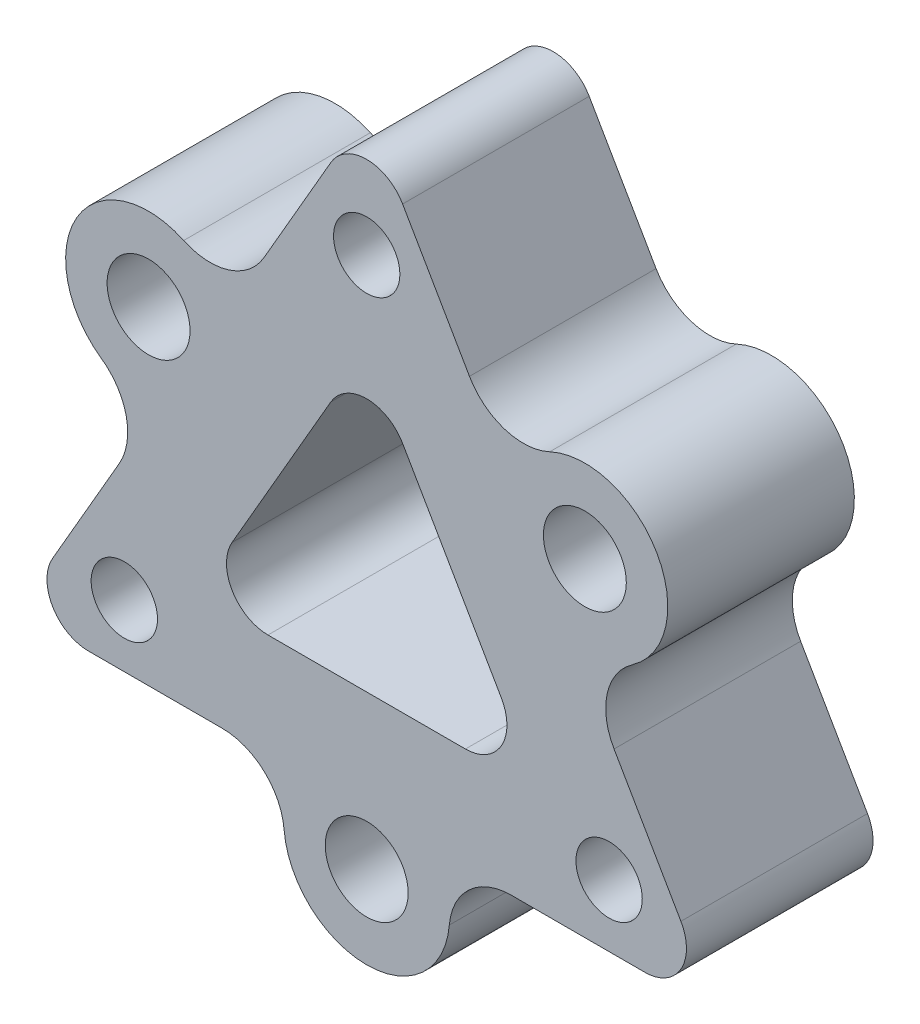
ISO-10303-21;
HEADER;
FILE_DESCRIPTION(('STEP AP214'),'2;1');
FILE_NAME('part.step','',(''),(''),'','','');
FILE_SCHEMA(('AUTOMOTIVE_DESIGN { 1 0 10303 214 1 1 1 1 }'));
ENDSEC;
DATA;
#1=APPLICATION_CONTEXT('core data for automotive mechanical design processes');
#2=APPLICATION_PROTOCOL_DEFINITION('international standard','automotive_design',2000,#1);
#3=PRODUCT_CONTEXT('',#1,'mechanical');
#4=PRODUCT('Part','Part','',(#3));
#5=PRODUCT_RELATED_PRODUCT_CATEGORY('part','',(#4));
#6=PRODUCT_DEFINITION_FORMATION('','',#4);
#7=PRODUCT_DEFINITION_CONTEXT('part definition',#1,'design');
#8=PRODUCT_DEFINITION('design','',#6,#7);
#9=PRODUCT_DEFINITION_SHAPE('','',#8);
#10=(LENGTH_UNIT() NAMED_UNIT(*) SI_UNIT(.MILLI.,.METRE.));
#11=(NAMED_UNIT(*) PLANE_ANGLE_UNIT() SI_UNIT($,.RADIAN.));
#12=(NAMED_UNIT(*) SI_UNIT($,.STERADIAN.) SOLID_ANGLE_UNIT());
#13=UNCERTAINTY_MEASURE_WITH_UNIT(LENGTH_MEASURE(1.E-05),#10,'distance_accuracy_value','');
#14=(GEOMETRIC_REPRESENTATION_CONTEXT(3) GLOBAL_UNCERTAINTY_ASSIGNED_CONTEXT((#13)) GLOBAL_UNIT_ASSIGNED_CONTEXT((#10,
#11,#12)) REPRESENTATION_CONTEXT('',''));
#15=CARTESIAN_POINT('',(0.,0.,0.));
#16=DIRECTION('',(0.,0.,1.));
#17=DIRECTION('',(1.,0.,0.));
#18=AXIS2_PLACEMENT_3D('',#15,#16,#17);
#19=CARTESIAN_POINT('',(-16.8874953737966,-9.75000000000001,9.));
#20=DIRECTION('',(0.,1.,0.));
#21=DIRECTION('',(-1.,0.,0.));
#22=AXIS2_PLACEMENT_3D('',#19,#20,#21);
#23=PLANE('',#22);
#24=DIRECTION('',(1.,0.,0.));
#25=VECTOR('',#24,1.);
#26=CARTESIAN_POINT('',(-16.8874953737966,-9.75000000000001,0.));
#27=LINE('',#26,#25);
#28=CARTESIAN_POINT('',(-13.4233937586588,-9.75000000000001,0.));
#29=VERTEX_POINT('',#28);
#30=CARTESIAN_POINT('',(-6.97423830966508,-9.75000000000001,0.));
#31=VERTEX_POINT('',#30);
#32=EDGE_CURVE('E231',#29,#31,#27,.T.);
#33=ORIENTED_EDGE('',*,*,#32,.T.);
#34=DIRECTION('',(0.,0.,1.));
#35=VECTOR('',#34,1.);
#36=CARTESIAN_POINT('',(-6.97423830966508,-9.75000000000001,9.));
#37=LINE('',#36,#35);
#38=CARTESIAN_POINT('',(-6.97423830966508,-9.75000000000001,9.));
#39=VERTEX_POINT('',#38);
#40=EDGE_CURVE('E300',#31,#39,#37,.T.);
#41=ORIENTED_EDGE('',*,*,#40,.T.);
#42=DIRECTION('',(1.,0.,0.));
#43=VECTOR('',#42,1.);
#44=CARTESIAN_POINT('',(-16.8874953737966,-9.75000000000001,9.));
#45=LINE('',#44,#43);
#46=CARTESIAN_POINT('',(-13.4233937586588,-9.75000000000001,9.));
#47=VERTEX_POINT('',#46);
#48=EDGE_CURVE('E223',#47,#39,#45,.T.);
#49=ORIENTED_EDGE('',*,*,#48,.F.);
#50=DIRECTION('',(0.,0.,-1.));
#51=VECTOR('',#50,1.);
#52=CARTESIAN_POINT('',(-13.4233937586588,-9.75000000000001,9.));
#53=LINE('',#52,#51);
#54=EDGE_CURVE('E257',#47,#29,#53,.T.);
#55=ORIENTED_EDGE('',*,*,#54,.T.);
#56=EDGE_LOOP('',(#33,#41,#49,#55));
#57=FACE_BOUND('',#56,.T.);
#58=ADVANCED_FACE('F35',(#57),#23,.F.);
#59=CARTESIAN_POINT('',(0.,19.5,9.));
#60=DIRECTION('',(0.866025403784438,-0.5,0.));
#61=DIRECTION('',(0.5,0.866025403784439,0.));
#62=AXIS2_PLACEMENT_3D('',#59,#60,#61);
#63=PLANE('',#62);
#64=DIRECTION('',(-0.5,-0.866025403784439,0.));
#65=VECTOR('',#64,1.);
#66=CARTESIAN_POINT('',(0.,19.5,0.));
#67=LINE('',#66,#65);
#68=CARTESIAN_POINT('',(-1.73205080756888,16.5,0.));
#69=VERTEX_POINT('',#68);
#70=CARTESIAN_POINT('',(-4.95662853206574,10.9148675482166,0.));
#71=VERTEX_POINT('',#70);
#72=EDGE_CURVE('E351',#69,#71,#67,.T.);
#73=ORIENTED_EDGE('',*,*,#72,.T.);
#74=DIRECTION('',(0.,0.,1.));
#75=VECTOR('',#74,1.);
#76=CARTESIAN_POINT('',(-4.95662853206574,10.9148675482166,9.));
#77=LINE('',#76,#75);
#78=CARTESIAN_POINT('',(-4.95662853206574,10.9148675482166,9.));
#79=VERTEX_POINT('',#78);
#80=EDGE_CURVE('E310',#71,#79,#77,.T.);
#81=ORIENTED_EDGE('',*,*,#80,.T.);
#82=DIRECTION('',(-0.5,-0.866025403784439,0.));
#83=VECTOR('',#82,1.);
#84=CARTESIAN_POINT('',(0.,19.5,9.));
#85=LINE('',#84,#83);
#86=CARTESIAN_POINT('',(-1.73205080756888,16.5,9.));
#87=VERTEX_POINT('',#86);
#88=EDGE_CURVE('E340',#87,#79,#85,.T.);
#89=ORIENTED_EDGE('',*,*,#88,.F.);
#90=DIRECTION('',(0.,0.,-1.));
#91=VECTOR('',#90,1.);
#92=CARTESIAN_POINT('',(-1.73205080756888,16.5,9.));
#93=LINE('',#92,#91);
#94=EDGE_CURVE('E269',#87,#69,#93,.T.);
#95=ORIENTED_EDGE('',*,*,#94,.T.);
#96=EDGE_LOOP('',(#73,#81,#89,#95));
#97=FACE_BOUND('',#96,.T.);
#98=ADVANCED_FACE('F349',(#97),#63,.F.);
#99=CARTESIAN_POINT('',(16.8874953737966,-9.75,9.));
#100=DIRECTION('',(-0.866025403784439,-0.5,0.));
#101=DIRECTION('',(0.5,-0.866025403784439,0.));
#102=AXIS2_PLACEMENT_3D('',#99,#100,#101);
#103=PLANE('',#102);
#104=DIRECTION('',(-0.5,0.866025403784439,0.));
#105=VECTOR('',#104,1.);
#106=CARTESIAN_POINT('',(16.8874953737966,-9.75,0.));
#107=LINE('',#106,#105);
#108=CARTESIAN_POINT('',(15.1554445662277,-6.75,0.));
#109=VERTEX_POINT('',#108);
#110=CARTESIAN_POINT('',(11.9308668417308,-1.1648675482166,0.));
#111=VERTEX_POINT('',#110);
#112=EDGE_CURVE('E354',#109,#111,#107,.T.);
#113=ORIENTED_EDGE('',*,*,#112,.T.);
#114=DIRECTION('',(0.,0.,1.));
#115=VECTOR('',#114,1.);
#116=CARTESIAN_POINT('',(11.9308668417308,-1.1648675482166,9.));
#117=LINE('',#116,#115);
#118=CARTESIAN_POINT('',(11.9308668417308,-1.1648675482166,9.));
#119=VERTEX_POINT('',#118);
#120=EDGE_CURVE('E283',#111,#119,#117,.T.);
#121=ORIENTED_EDGE('',*,*,#120,.T.);
#122=DIRECTION('',(-0.5,0.866025403784439,0.));
#123=VECTOR('',#122,1.);
#124=CARTESIAN_POINT('',(16.8874953737966,-9.75,9.));
#125=LINE('',#124,#123);
#126=CARTESIAN_POINT('',(15.1554445662277,-6.75,9.));
#127=VERTEX_POINT('',#126);
#128=EDGE_CURVE('E361',#127,#119,#125,.T.);
#129=ORIENTED_EDGE('',*,*,#128,.F.);
#130=DIRECTION('',(0.,0.,-1.));
#131=VECTOR('',#130,1.);
#132=CARTESIAN_POINT('',(15.1554445662277,-6.75,9.));
#133=LINE('',#132,#131);
#134=EDGE_CURVE('E245',#127,#109,#133,.T.);
#135=ORIENTED_EDGE('',*,*,#134,.T.);
#136=EDGE_LOOP('',(#113,#121,#129,#135));
#137=FACE_BOUND('',#136,.T.);
#138=ADVANCED_FACE('F482',(#137),#103,.F.);
#139=CARTESIAN_POINT('',(0.,0.,9.));
#140=DIRECTION('',(0.,0.,1.));
#141=DIRECTION('',(1.,0.,0.));
#142=AXIS2_PLACEMENT_3D('',#139,#140,#141);
#143=PLANE('',#142);
#144=ORIENTED_EDGE('',*,*,#48,.T.);
#145=CARTESIAN_POINT('',(-6.97423830966508,-12.75,9.));
#146=DIRECTION('',(0.,0.,1.));
#147=DIRECTION('',(1.,0.,0.));
#148=AXIS2_PLACEMENT_3D('',#145,#146,#147);
#149=CIRCLE('',#148,3.);
#150=CARTESIAN_POINT('',(-3.98527903409433,-12.4928571428571,9.));
#151=VERTEX_POINT('',#150);
#152=EDGE_CURVE('E324',#39,#151,#149,.F.);
#153=ORIENTED_EDGE('',*,*,#152,.T.);
#154=CARTESIAN_POINT('',(0.,-12.15,9.));
#155=DIRECTION('',(0.,0.,1.));
#156=DIRECTION('',(1.,0.,0.));
#157=AXIS2_PLACEMENT_3D('',#154,#155,#156);
#158=CIRCLE('',#157,4.);
#159=CARTESIAN_POINT('',(3.98527903409433,-12.4928571428571,9.));
#160=VERTEX_POINT('',#159);
#161=EDGE_CURVE('E415',#151,#160,#158,.T.);
#162=ORIENTED_EDGE('',*,*,#161,.T.);
#163=CARTESIAN_POINT('',(6.97423830966508,-12.75,9.));
#164=DIRECTION('',(0.,0.,1.));
#165=DIRECTION('',(1.,0.,0.));
#166=AXIS2_PLACEMENT_3D('',#163,#164,#165);
#167=CIRCLE('',#166,3.);
#168=CARTESIAN_POINT('',(6.97423830966508,-9.75,9.));
#169=VERTEX_POINT('',#168);
#170=EDGE_CURVE('E330',#160,#169,#167,.F.);
#171=ORIENTED_EDGE('',*,*,#170,.T.);
#172=CARTESIAN_POINT('',(13.4233937586588,-9.75,9.));
#173=VERTEX_POINT('',#172);
#174=EDGE_CURVE('E228',#169,#173,#45,.T.);
#175=ORIENTED_EDGE('',*,*,#174,.T.);
#176=CARTESIAN_POINT('',(13.4233937586588,-7.75,9.));
#177=DIRECTION('',(0.,0.,1.));
#178=DIRECTION('',(1.,0.,0.));
#179=AXIS2_PLACEMENT_3D('',#176,#177,#178);
#180=CIRCLE('',#179,2.);
#181=EDGE_CURVE('E267',#173,#127,#180,.T.);
#182=ORIENTED_EDGE('',*,*,#181,.T.);
#183=ORIENTED_EDGE('',*,*,#128,.T.);
#184=CARTESIAN_POINT('',(14.5289430530841,0.335132451783403,9.));
#185=DIRECTION('',(0.,0.,1.));
#186=DIRECTION('',(1.,0.,0.));
#187=AXIS2_PLACEMENT_3D('',#184,#185,#186);
#188=CIRCLE('',#187,3.);
#189=CARTESIAN_POINT('',(12.8117711686113,2.79507568673337,9.));
#190=VERTEX_POINT('',#189);
#191=EDGE_CURVE('E312',#119,#190,#188,.F.);
#192=ORIENTED_EDGE('',*,*,#191,.T.);
#193=CARTESIAN_POINT('',(10.5222086559809,6.07500000000001,9.));
#194=DIRECTION('',(0.,0.,1.));
#195=DIRECTION('',(1.,0.,0.));
#196=AXIS2_PLACEMENT_3D('',#193,#194,#195);
#197=CIRCLE('',#196,4.);
#198=CARTESIAN_POINT('',(8.826492134517,9.69778145612378,9.));
#199=VERTEX_POINT('',#198);
#200=EDGE_CURVE('E397',#190,#199,#197,.T.);
#201=ORIENTED_EDGE('',*,*,#200,.T.);
#202=CARTESIAN_POINT('',(7.55470474341905,12.4148675482166,9.));
#203=DIRECTION('',(0.,0.,1.));
#204=DIRECTION('',(1.,0.,0.));
#205=AXIS2_PLACEMENT_3D('',#202,#203,#204);
#206=CIRCLE('',#205,3.);
#207=CARTESIAN_POINT('',(4.95662853206573,10.9148675482166,9.));
#208=VERTEX_POINT('',#207);
#209=EDGE_CURVE('E318',#199,#208,#206,.F.);
#210=ORIENTED_EDGE('',*,*,#209,.T.);
#211=CARTESIAN_POINT('',(1.73205080756887,16.5,9.));
#212=VERTEX_POINT('',#211);
#213=EDGE_CURVE('E364',#208,#212,#125,.T.);
#214=ORIENTED_EDGE('',*,*,#213,.T.);
#215=CARTESIAN_POINT('',(0.,15.5,9.));
#216=DIRECTION('',(0.,0.,1.));
#217=DIRECTION('',(1.,0.,0.));
#218=AXIS2_PLACEMENT_3D('',#215,#216,#217);
#219=CIRCLE('',#218,2.);
#220=EDGE_CURVE('E263',#212,#87,#219,.T.);
#221=ORIENTED_EDGE('',*,*,#220,.T.);
#222=ORIENTED_EDGE('',*,*,#88,.T.);
#223=CARTESIAN_POINT('',(-7.55470474341906,12.4148675482166,9.));
#224=DIRECTION('',(0.,0.,1.));
#225=DIRECTION('',(1.,0.,0.));
#226=AXIS2_PLACEMENT_3D('',#223,#224,#225);
#227=CIRCLE('',#226,3.);
#228=CARTESIAN_POINT('',(-8.826492134517,9.69778145612377,9.));
#229=VERTEX_POINT('',#228);
#230=EDGE_CURVE('E43',#79,#229,#227,.F.);
#231=ORIENTED_EDGE('',*,*,#230,.T.);
#232=CARTESIAN_POINT('',(-10.5222086559809,6.075,9.));
#233=DIRECTION('',(0.,0.,1.));
#234=DIRECTION('',(1.,0.,0.));
#235=AXIS2_PLACEMENT_3D('',#232,#233,#234);
#236=CIRCLE('',#235,4.);
#237=CARTESIAN_POINT('',(-12.8117711686113,2.79507568673337,9.));
#238=VERTEX_POINT('',#237);
#239=EDGE_CURVE('E337',#229,#238,#236,.T.);
#240=ORIENTED_EDGE('',*,*,#239,.T.);
#241=CARTESIAN_POINT('',(-14.5289430530841,0.3351324517834,9.));
#242=DIRECTION('',(0.,0.,1.));
#243=DIRECTION('',(1.,0.,0.));
#244=AXIS2_PLACEMENT_3D('',#241,#242,#243);
#245=CIRCLE('',#244,3.);
#246=CARTESIAN_POINT('',(-11.9308668417308,-1.1648675482166,9.));
#247=VERTEX_POINT('',#246);
#248=EDGE_CURVE('E322',#238,#247,#245,.F.);
#249=ORIENTED_EDGE('',*,*,#248,.T.);
#250=CARTESIAN_POINT('',(-15.1554445662277,-6.75000000000001,9.));
#251=VERTEX_POINT('',#250);
#252=EDGE_CURVE('E360',#247,#251,#85,.T.);
#253=ORIENTED_EDGE('',*,*,#252,.T.);
#254=CARTESIAN_POINT('',(-13.4233937586588,-7.75000000000001,9.));
#255=DIRECTION('',(0.,0.,1.));
#256=DIRECTION('',(1.,0.,0.));
#257=AXIS2_PLACEMENT_3D('',#254,#255,#256);
#258=CIRCLE('',#257,2.);
#259=EDGE_CURVE('E265',#251,#47,#258,.T.);
#260=ORIENTED_EDGE('',*,*,#259,.T.);
#261=EDGE_LOOP('',(#144,#153,#162,#171,#175,#182,#183,#192,#201,#210,#214,#221,#222,#231,#240,
#249,#253,#260));
#262=FACE_BOUND('',#261,.T.);
#263=CARTESIAN_POINT('',(-11.6913429510899,-6.75000000000001,9.));
#264=DIRECTION('',(0.,0.,1.));
#265=DIRECTION('',(1.,0.,0.));
#266=AXIS2_PLACEMENT_3D('',#263,#264,#265);
#267=CIRCLE('',#266,1.6);
#268=CARTESIAN_POINT('',(-10.0913429510899,-6.75000000000001,9.));
#269=VERTEX_POINT('',#268);
#270=EDGE_CURVE('E369',#269,#269,#267,.T.);
#271=ORIENTED_EDGE('',*,*,#270,.F.);
#272=EDGE_LOOP('',(#271));
#273=FACE_BOUND('',#272,.T.);
#274=CARTESIAN_POINT('',(11.6913429510899,-6.75,9.));
#275=DIRECTION('',(0.,0.,1.));
#276=DIRECTION('',(1.,0.,0.));
#277=AXIS2_PLACEMENT_3D('',#274,#275,#276);
#278=CIRCLE('',#277,1.6);
#279=CARTESIAN_POINT('',(13.2913429510899,-6.75,9.));
#280=VERTEX_POINT('',#279);
#281=EDGE_CURVE('E368',#280,#280,#278,.T.);
#282=ORIENTED_EDGE('',*,*,#281,.F.);
#283=EDGE_LOOP('',(#282));
#284=FACE_BOUND('',#283,.T.);
#285=CARTESIAN_POINT('',(0.,13.5,9.));
#286=DIRECTION('',(0.,0.,1.));
#287=DIRECTION('',(1.,0.,0.));
#288=AXIS2_PLACEMENT_3D('',#285,#286,#287);
#289=CIRCLE('',#288,1.6);
#290=CARTESIAN_POINT('',(1.6,13.5,9.));
#291=VERTEX_POINT('',#290);
#292=EDGE_CURVE('E375',#291,#291,#289,.T.);
#293=ORIENTED_EDGE('',*,*,#292,.F.);
#294=EDGE_LOOP('',(#293));
#295=FACE_BOUND('',#294,.T.);
#296=DIRECTION('',(-0.5,0.866025403784439,0.));
#297=VECTOR('',#296,1.);
#298=CARTESIAN_POINT('',(8.22724133595217,-4.75,9.));
#299=LINE('',#298,#297);
#300=CARTESIAN_POINT('',(6.49519052838329,-1.75,9.));
#301=VERTEX_POINT('',#300);
#302=CARTESIAN_POINT('',(1.73205080756888,6.5,9.));
#303=VERTEX_POINT('',#302);
#304=EDGE_CURVE('E390',#301,#303,#299,.T.);
#305=ORIENTED_EDGE('',*,*,#304,.F.);
#306=CARTESIAN_POINT('',(4.76313972081442,-2.75,9.));
#307=DIRECTION('',(0.,0.,1.));
#308=DIRECTION('',(1.,0.,0.));
#309=AXIS2_PLACEMENT_3D('',#306,#307,#308);
#310=CIRCLE('',#309,2.);
#311=CARTESIAN_POINT('',(4.76313972081442,-4.75,9.));
#312=VERTEX_POINT('',#311);
#313=EDGE_CURVE('E208',#301,#312,#310,.F.);
#314=ORIENTED_EDGE('',*,*,#313,.T.);
#315=DIRECTION('',(1.,0.,0.));
#316=VECTOR('',#315,1.);
#317=CARTESIAN_POINT('',(-8.22724133595218,-4.75000000000001,9.));
#318=LINE('',#317,#316);
#319=CARTESIAN_POINT('',(-4.76313972081442,-4.75000000000001,9.));
#320=VERTEX_POINT('',#319);
#321=EDGE_CURVE('E384',#320,#312,#318,.T.);
#322=ORIENTED_EDGE('',*,*,#321,.F.);
#323=CARTESIAN_POINT('',(-4.76313972081442,-2.75,9.));
#324=DIRECTION('',(0.,0.,1.));
#325=DIRECTION('',(1.,0.,0.));
#326=AXIS2_PLACEMENT_3D('',#323,#324,#325);
#327=CIRCLE('',#326,2.);
#328=CARTESIAN_POINT('',(-6.4951905283833,-1.75,9.));
#329=VERTEX_POINT('',#328);
#330=EDGE_CURVE('E209',#320,#329,#327,.F.);
#331=ORIENTED_EDGE('',*,*,#330,.T.);
#332=DIRECTION('',(-0.5,-0.866025403784439,0.));
#333=VECTOR('',#332,1.);
#334=CARTESIAN_POINT('',(0.,9.5,9.));
#335=LINE('',#334,#333);
#336=CARTESIAN_POINT('',(-1.73205080756888,6.5,9.));
#337=VERTEX_POINT('',#336);
#338=EDGE_CURVE('E381',#337,#329,#335,.T.);
#339=ORIENTED_EDGE('',*,*,#338,.F.);
#340=CARTESIAN_POINT('',(0.,5.5,9.));
#341=DIRECTION('',(0.,0.,1.));
#342=DIRECTION('',(1.,0.,0.));
#343=AXIS2_PLACEMENT_3D('',#340,#341,#342);
#344=CIRCLE('',#343,2.);
#345=EDGE_CURVE('E277',#337,#303,#344,.F.);
#346=ORIENTED_EDGE('',*,*,#345,.T.);
#347=EDGE_LOOP('',(#305,#314,#322,#331,#339,#346));
#348=FACE_BOUND('',#347,.T.);
#349=CARTESIAN_POINT('',(10.5222086559809,6.07500000000001,9.));
#350=DIRECTION('',(0.,0.,1.));
#351=DIRECTION('',(1.,0.,0.));
#352=AXIS2_PLACEMENT_3D('',#349,#350,#351);
#353=CIRCLE('',#352,2.);
#354=CARTESIAN_POINT('',(12.5222086559809,6.07500000000001,9.));
#355=VERTEX_POINT('',#354);
#356=EDGE_CURVE('E400',#355,#355,#353,.T.);
#357=ORIENTED_EDGE('',*,*,#356,.F.);
#358=EDGE_LOOP('',(#357));
#359=FACE_BOUND('',#358,.T.);
#360=CARTESIAN_POINT('',(-10.5222086559809,6.075,9.));
#361=DIRECTION('',(0.,0.,1.));
#362=DIRECTION('',(1.,0.,0.));
#363=AXIS2_PLACEMENT_3D('',#360,#361,#362);
#364=CIRCLE('',#363,2.);
#365=CARTESIAN_POINT('',(-8.52220865598093,6.075,9.));
#366=VERTEX_POINT('',#365);
#367=EDGE_CURVE('E346',#366,#366,#364,.T.);
#368=ORIENTED_EDGE('',*,*,#367,.F.);
#369=EDGE_LOOP('',(#368));
#370=FACE_BOUND('',#369,.T.);
#371=CARTESIAN_POINT('',(0.,-12.15,9.));
#372=DIRECTION('',(0.,0.,1.));
#373=DIRECTION('',(1.,0.,0.));
#374=AXIS2_PLACEMENT_3D('',#371,#372,#373);
#375=CIRCLE('',#374,2.);
#376=CARTESIAN_POINT('',(2.,-12.15,9.));
#377=VERTEX_POINT('',#376);
#378=EDGE_CURVE('E418',#377,#377,#375,.T.);
#379=ORIENTED_EDGE('',*,*,#378,.F.);
#380=EDGE_LOOP('',(#379));
#381=FACE_BOUND('',#380,.T.);
#382=ADVANCED_FACE('F335',(#262,#273,#284,#295,#348,#359,#370,#381),#143,.T.);
#383=CARTESIAN_POINT('',(0.,0.,0.));
#384=DIRECTION('',(0.,0.,1.));
#385=DIRECTION('',(1.,0.,0.));
#386=AXIS2_PLACEMENT_3D('',#383,#384,#385);
#387=PLANE('',#386);
#388=CARTESIAN_POINT('',(0.,13.5,0.));
#389=DIRECTION('',(0.,0.,1.));
#390=DIRECTION('',(1.,0.,0.));
#391=AXIS2_PLACEMENT_3D('',#388,#389,#390);
#392=CIRCLE('',#391,1.6);
#393=CARTESIAN_POINT('',(1.6,13.5,0.));
#394=VERTEX_POINT('',#393);
#395=EDGE_CURVE('E378',#394,#394,#392,.T.);
#396=ORIENTED_EDGE('',*,*,#395,.T.);
#397=EDGE_LOOP('',(#396));
#398=FACE_BOUND('',#397,.T.);
#399=CARTESIAN_POINT('',(-11.6913429510899,-6.75000000000001,0.));
#400=DIRECTION('',(0.,0.,1.));
#401=DIRECTION('',(1.,0.,0.));
#402=AXIS2_PLACEMENT_3D('',#399,#400,#401);
#403=CIRCLE('',#402,1.6);
#404=CARTESIAN_POINT('',(-10.0913429510899,-6.75000000000001,0.));
#405=VERTEX_POINT('',#404);
#406=EDGE_CURVE('E372',#405,#405,#403,.T.);
#407=ORIENTED_EDGE('',*,*,#406,.T.);
#408=EDGE_LOOP('',(#407));
#409=FACE_BOUND('',#408,.T.);
#410=CARTESIAN_POINT('',(11.6913429510899,-6.75,0.));
#411=DIRECTION('',(0.,0.,1.));
#412=DIRECTION('',(1.,0.,0.));
#413=AXIS2_PLACEMENT_3D('',#410,#411,#412);
#414=CIRCLE('',#413,1.6);
#415=CARTESIAN_POINT('',(13.2913429510899,-6.75,0.));
#416=VERTEX_POINT('',#415);
#417=EDGE_CURVE('E365',#416,#416,#414,.T.);
#418=ORIENTED_EDGE('',*,*,#417,.T.);
#419=EDGE_LOOP('',(#418));
#420=FACE_BOUND('',#419,.T.);
#421=CARTESIAN_POINT('',(6.97423830966508,-9.75,0.));
#422=VERTEX_POINT('',#421);
#423=CARTESIAN_POINT('',(13.4233937586588,-9.75,0.));
#424=VERTEX_POINT('',#423);
#425=EDGE_CURVE('E352',#422,#424,#27,.T.);
#426=ORIENTED_EDGE('',*,*,#425,.F.);
#427=CARTESIAN_POINT('',(6.97423830966508,-12.75,0.));
#428=DIRECTION('',(0.,0.,1.));
#429=DIRECTION('',(1.,0.,0.));
#430=AXIS2_PLACEMENT_3D('',#427,#428,#429);
#431=CIRCLE('',#430,3.);
#432=CARTESIAN_POINT('',(3.98527903409433,-12.4928571428571,0.));
#433=VERTEX_POINT('',#432);
#434=EDGE_CURVE('E328',#422,#433,#431,.T.);
#435=ORIENTED_EDGE('',*,*,#434,.T.);
#436=CARTESIAN_POINT('',(0.,-12.15,0.));
#437=DIRECTION('',(0.,0.,1.));
#438=DIRECTION('',(1.,0.,0.));
#439=AXIS2_PLACEMENT_3D('',#436,#437,#438);
#440=CIRCLE('',#439,4.);
#441=CARTESIAN_POINT('',(-3.98527903409433,-12.4928571428571,0.));
#442=VERTEX_POINT('',#441);
#443=EDGE_CURVE('E410',#433,#442,#440,.F.);
#444=ORIENTED_EDGE('',*,*,#443,.T.);
#445=CARTESIAN_POINT('',(-6.97423830966508,-12.75,0.));
#446=DIRECTION('',(0.,0.,1.));
#447=DIRECTION('',(1.,0.,0.));
#448=AXIS2_PLACEMENT_3D('',#445,#446,#447);
#449=CIRCLE('',#448,3.);
#450=EDGE_CURVE('E326',#442,#31,#449,.T.);
#451=ORIENTED_EDGE('',*,*,#450,.T.);
#452=ORIENTED_EDGE('',*,*,#32,.F.);
#453=CARTESIAN_POINT('',(-13.4233937586588,-7.75000000000001,0.));
#454=DIRECTION('',(0.,0.,1.));
#455=DIRECTION('',(1.,0.,0.));
#456=AXIS2_PLACEMENT_3D('',#453,#454,#455);
#457=CIRCLE('',#456,2.);
#458=CARTESIAN_POINT('',(-15.1554445662277,-6.75000000000001,0.));
#459=VERTEX_POINT('',#458);
#460=EDGE_CURVE('E251',#29,#459,#457,.F.);
#461=ORIENTED_EDGE('',*,*,#460,.T.);
#462=CARTESIAN_POINT('',(-11.9308668417308,-1.1648675482166,0.));
#463=VERTEX_POINT('',#462);
#464=EDGE_CURVE('E353',#463,#459,#67,.T.);
#465=ORIENTED_EDGE('',*,*,#464,.F.);
#466=CARTESIAN_POINT('',(-14.5289430530841,0.3351324517834,0.));
#467=DIRECTION('',(0.,0.,1.));
#468=DIRECTION('',(1.,0.,0.));
#469=AXIS2_PLACEMENT_3D('',#466,#467,#468);
#470=CIRCLE('',#469,3.);
#471=CARTESIAN_POINT('',(-12.8117711686113,2.79507568673337,0.));
#472=VERTEX_POINT('',#471);
#473=EDGE_CURVE('E320',#463,#472,#470,.T.);
#474=ORIENTED_EDGE('',*,*,#473,.T.);
#475=CARTESIAN_POINT('',(-10.5222086559809,6.075,0.));
#476=DIRECTION('',(0.,0.,1.));
#477=DIRECTION('',(1.,0.,0.));
#478=AXIS2_PLACEMENT_3D('',#475,#476,#477);
#479=CIRCLE('',#478,4.);
#480=CARTESIAN_POINT('',(-8.826492134517,9.69778145612377,0.));
#481=VERTEX_POINT('',#480);
#482=EDGE_CURVE('E403',#472,#481,#479,.F.);
#483=ORIENTED_EDGE('',*,*,#482,.T.);
#484=CARTESIAN_POINT('',(-7.55470474341906,12.4148675482166,0.));
#485=DIRECTION('',(0.,0.,1.));
#486=DIRECTION('',(1.,0.,0.));
#487=AXIS2_PLACEMENT_3D('',#484,#485,#486);
#488=CIRCLE('',#487,3.);
#489=EDGE_CURVE('E11',#481,#71,#488,.T.);
#490=ORIENTED_EDGE('',*,*,#489,.T.);
#491=ORIENTED_EDGE('',*,*,#72,.F.);
#492=CARTESIAN_POINT('',(0.,15.5,0.));
#493=DIRECTION('',(0.,0.,1.));
#494=DIRECTION('',(1.,0.,0.));
#495=AXIS2_PLACEMENT_3D('',#492,#493,#494);
#496=CIRCLE('',#495,2.);
#497=CARTESIAN_POINT('',(1.73205080756887,16.5,0.));
#498=VERTEX_POINT('',#497);
#499=EDGE_CURVE('E248',#69,#498,#496,.F.);
#500=ORIENTED_EDGE('',*,*,#499,.T.);
#501=CARTESIAN_POINT('',(4.95662853206573,10.9148675482166,0.));
#502=VERTEX_POINT('',#501);
#503=EDGE_CURVE('E357',#502,#498,#107,.T.);
#504=ORIENTED_EDGE('',*,*,#503,.F.);
#505=CARTESIAN_POINT('',(7.55470474341905,12.4148675482166,0.));
#506=DIRECTION('',(0.,0.,1.));
#507=DIRECTION('',(1.,0.,0.));
#508=AXIS2_PLACEMENT_3D('',#505,#506,#507);
#509=CIRCLE('',#508,3.);
#510=CARTESIAN_POINT('',(8.826492134517,9.69778145612378,0.));
#511=VERTEX_POINT('',#510);
#512=EDGE_CURVE('E316',#502,#511,#509,.T.);
#513=ORIENTED_EDGE('',*,*,#512,.T.);
#514=CARTESIAN_POINT('',(10.5222086559809,6.07500000000001,0.));
#515=DIRECTION('',(0.,0.,1.));
#516=DIRECTION('',(1.,0.,0.));
#517=AXIS2_PLACEMENT_3D('',#514,#515,#516);
#518=CIRCLE('',#517,4.);
#519=CARTESIAN_POINT('',(12.8117711686113,2.79507568673337,0.));
#520=VERTEX_POINT('',#519);
#521=EDGE_CURVE('E387',#511,#520,#518,.F.);
#522=ORIENTED_EDGE('',*,*,#521,.T.);
#523=CARTESIAN_POINT('',(14.5289430530841,0.335132451783403,0.));
#524=DIRECTION('',(0.,0.,1.));
#525=DIRECTION('',(1.,0.,0.));
#526=AXIS2_PLACEMENT_3D('',#523,#524,#525);
#527=CIRCLE('',#526,3.);
#528=EDGE_CURVE('E314',#520,#111,#527,.T.);
#529=ORIENTED_EDGE('',*,*,#528,.T.);
#530=ORIENTED_EDGE('',*,*,#112,.F.);
#531=CARTESIAN_POINT('',(13.4233937586588,-7.75,0.));
#532=DIRECTION('',(0.,0.,1.));
#533=DIRECTION('',(1.,0.,0.));
#534=AXIS2_PLACEMENT_3D('',#531,#532,#533);
#535=CIRCLE('',#534,2.);
#536=EDGE_CURVE('E254',#109,#424,#535,.F.);
#537=ORIENTED_EDGE('',*,*,#536,.T.);
#538=EDGE_LOOP('',(#426,#435,#444,#451,#452,#461,#465,#474,#483,#490,#491,#500,#504,#513,#522,
#529,#530,#537));
#539=FACE_BOUND('',#538,.T.);
#540=DIRECTION('',(-0.5,-0.866025403784439,0.));
#541=VECTOR('',#540,1.);
#542=CARTESIAN_POINT('',(0.,9.5,0.));
#543=LINE('',#542,#541);
#544=CARTESIAN_POINT('',(-1.73205080756888,6.5,0.));
#545=VERTEX_POINT('',#544);
#546=CARTESIAN_POINT('',(-6.4951905283833,-1.75,0.));
#547=VERTEX_POINT('',#546);
#548=EDGE_CURVE('E219',#545,#547,#543,.T.);
#549=ORIENTED_EDGE('',*,*,#548,.T.);
#550=CARTESIAN_POINT('',(-4.76313972081442,-2.75,0.));
#551=DIRECTION('',(0.,0.,1.));
#552=DIRECTION('',(1.,0.,0.));
#553=AXIS2_PLACEMENT_3D('',#550,#551,#552);
#554=CIRCLE('',#553,2.);
#555=CARTESIAN_POINT('',(-4.76313972081442,-4.75000000000001,0.));
#556=VERTEX_POINT('',#555);
#557=EDGE_CURVE('E279',#547,#556,#554,.T.);
#558=ORIENTED_EDGE('',*,*,#557,.T.);
#559=DIRECTION('',(1.,0.,0.));
#560=VECTOR('',#559,1.);
#561=CARTESIAN_POINT('',(-8.22724133595218,-4.75000000000001,0.));
#562=LINE('',#561,#560);
#563=CARTESIAN_POINT('',(4.76313972081442,-4.75,0.));
#564=VERTEX_POINT('',#563);
#565=EDGE_CURVE('E203',#556,#564,#562,.T.);
#566=ORIENTED_EDGE('',*,*,#565,.T.);
#567=CARTESIAN_POINT('',(4.76313972081442,-2.75,0.));
#568=DIRECTION('',(0.,0.,1.));
#569=DIRECTION('',(1.,0.,0.));
#570=AXIS2_PLACEMENT_3D('',#567,#568,#569);
#571=CIRCLE('',#570,2.);
#572=CARTESIAN_POINT('',(6.49519052838329,-1.75,0.));
#573=VERTEX_POINT('',#572);
#574=EDGE_CURVE('E196',#564,#573,#571,.T.);
#575=ORIENTED_EDGE('',*,*,#574,.T.);
#576=DIRECTION('',(-0.5,0.866025403784439,0.));
#577=VECTOR('',#576,1.);
#578=CARTESIAN_POINT('',(8.22724133595217,-4.75,0.));
#579=LINE('',#578,#577);
#580=CARTESIAN_POINT('',(1.73205080756888,6.5,0.));
#581=VERTEX_POINT('',#580);
#582=EDGE_CURVE('E201',#573,#581,#579,.T.);
#583=ORIENTED_EDGE('',*,*,#582,.T.);
#584=CARTESIAN_POINT('',(0.,5.5,0.));
#585=DIRECTION('',(0.,0.,1.));
#586=DIRECTION('',(1.,0.,0.));
#587=AXIS2_PLACEMENT_3D('',#584,#585,#586);
#588=CIRCLE('',#587,2.);
#589=EDGE_CURVE('E275',#581,#545,#588,.T.);
#590=ORIENTED_EDGE('',*,*,#589,.T.);
#591=EDGE_LOOP('',(#549,#558,#566,#575,#583,#590));
#592=FACE_BOUND('',#591,.T.);
#593=CARTESIAN_POINT('',(10.5222086559809,6.07500000000001,0.));
#594=DIRECTION('',(0.,0.,1.));
#595=DIRECTION('',(1.,0.,0.));
#596=AXIS2_PLACEMENT_3D('',#593,#594,#595);
#597=CIRCLE('',#596,2.);
#598=CARTESIAN_POINT('',(12.5222086559809,6.07500000000001,0.));
#599=VERTEX_POINT('',#598);
#600=EDGE_CURVE('E394',#599,#599,#597,.F.);
#601=ORIENTED_EDGE('',*,*,#600,.F.);
#602=EDGE_LOOP('',(#601));
#603=FACE_BOUND('',#602,.T.);
#604=CARTESIAN_POINT('',(-10.5222086559809,6.075,0.));
#605=DIRECTION('',(0.,0.,1.));
#606=DIRECTION('',(1.,0.,0.));
#607=AXIS2_PLACEMENT_3D('',#604,#605,#606);
#608=CIRCLE('',#607,2.);
#609=CARTESIAN_POINT('',(-8.52220865598093,6.075,0.));
#610=VERTEX_POINT('',#609);
#611=EDGE_CURVE('E345',#610,#610,#608,.F.);
#612=ORIENTED_EDGE('',*,*,#611,.F.);
#613=EDGE_LOOP('',(#612));
#614=FACE_BOUND('',#613,.T.);
#615=CARTESIAN_POINT('',(0.,-12.15,0.));
#616=DIRECTION('',(0.,0.,1.));
#617=DIRECTION('',(1.,0.,0.));
#618=AXIS2_PLACEMENT_3D('',#615,#616,#617);
#619=CIRCLE('',#618,2.);
#620=CARTESIAN_POINT('',(2.,-12.15,0.));
#621=VERTEX_POINT('',#620);
#622=EDGE_CURVE('E412',#621,#621,#619,.F.);
#623=ORIENTED_EDGE('',*,*,#622,.F.);
#624=EDGE_LOOP('',(#623));
#625=FACE_BOUND('',#624,.T.);
#626=ADVANCED_FACE('F199',(#398,#409,#420,#539,#592,#603,#614,#625),#387,.F.);
#627=ORIENTED_EDGE('',*,*,#213,.F.);
#628=DIRECTION('',(0.,0.,1.));
#629=VECTOR('',#628,1.);
#630=CARTESIAN_POINT('',(4.95662853206574,10.9148675482166,9.));
#631=LINE('',#630,#629);
#632=EDGE_CURVE('E290',#208,#502,#631,.F.);
#633=ORIENTED_EDGE('',*,*,#632,.T.);
#634=ORIENTED_EDGE('',*,*,#503,.T.);
#635=DIRECTION('',(0.,0.,-1.));
#636=VECTOR('',#635,1.);
#637=CARTESIAN_POINT('',(1.73205080756888,16.5,9.));
#638=LINE('',#637,#636);
#639=EDGE_CURVE('E242',#498,#212,#638,.F.);
#640=ORIENTED_EDGE('',*,*,#639,.T.);
#641=EDGE_LOOP('',(#627,#633,#634,#640));
#642=FACE_BOUND('',#641,.T.);
#643=ADVANCED_FACE('F449',(#642),#103,.F.);
#644=ORIENTED_EDGE('',*,*,#252,.F.);
#645=DIRECTION('',(0.,0.,1.));
#646=VECTOR('',#645,1.);
#647=CARTESIAN_POINT('',(-11.9308668417308,-1.1648675482166,9.));
#648=LINE('',#647,#646);
#649=EDGE_CURVE('E293',#247,#463,#648,.F.);
#650=ORIENTED_EDGE('',*,*,#649,.T.);
#651=ORIENTED_EDGE('',*,*,#464,.T.);
#652=DIRECTION('',(0.,0.,-1.));
#653=VECTOR('',#652,1.);
#654=CARTESIAN_POINT('',(-15.1554445662277,-6.75000000000001,9.));
#655=LINE('',#654,#653);
#656=EDGE_CURVE('E272',#459,#251,#655,.F.);
#657=ORIENTED_EDGE('',*,*,#656,.T.);
#658=EDGE_LOOP('',(#644,#650,#651,#657));
#659=FACE_BOUND('',#658,.T.);
#660=ADVANCED_FACE('F484',(#659),#63,.F.);
#661=ORIENTED_EDGE('',*,*,#174,.F.);
#662=DIRECTION('',(0.,0.,1.));
#663=VECTOR('',#662,1.);
#664=CARTESIAN_POINT('',(6.97423830966508,-9.75,9.));
#665=LINE('',#664,#663);
#666=EDGE_CURVE('E307',#169,#422,#665,.F.);
#667=ORIENTED_EDGE('',*,*,#666,.T.);
#668=ORIENTED_EDGE('',*,*,#425,.T.);
#669=DIRECTION('',(0.,0.,-1.));
#670=VECTOR('',#669,1.);
#671=CARTESIAN_POINT('',(13.4233937586588,-9.75,9.));
#672=LINE('',#671,#670);
#673=EDGE_CURVE('E260',#424,#173,#672,.F.);
#674=ORIENTED_EDGE('',*,*,#673,.T.);
#675=EDGE_LOOP('',(#661,#667,#668,#674));
#676=FACE_BOUND('',#675,.T.);
#677=ADVANCED_FACE('F477',(#676),#23,.F.);
#678=CARTESIAN_POINT('',(11.6913429510899,-6.75,9.));
#679=DIRECTION('',(0.,0.,-1.));
#680=DIRECTION('',(-1.,0.,0.));
#681=AXIS2_PLACEMENT_3D('',#678,#679,#680);
#682=CYLINDRICAL_SURFACE('',#681,1.6);
#683=ORIENTED_EDGE('',*,*,#281,.T.);
#684=EDGE_LOOP('',(#683));
#685=FACE_BOUND('',#684,.T.);
#686=ORIENTED_EDGE('',*,*,#417,.F.);
#687=EDGE_LOOP('',(#686));
#688=FACE_BOUND('',#687,.T.);
#689=ADVANCED_FACE('F487',(#685,#688),#682,.F.);
#690=CARTESIAN_POINT('',(-11.6913429510899,-6.75000000000001,9.));
#691=DIRECTION('',(0.,0.,-1.));
#692=DIRECTION('',(-1.,0.,0.));
#693=AXIS2_PLACEMENT_3D('',#690,#691,#692);
#694=CYLINDRICAL_SURFACE('',#693,1.6);
#695=ORIENTED_EDGE('',*,*,#270,.T.);
#696=EDGE_LOOP('',(#695));
#697=FACE_BOUND('',#696,.T.);
#698=ORIENTED_EDGE('',*,*,#406,.F.);
#699=EDGE_LOOP('',(#698));
#700=FACE_BOUND('',#699,.T.);
#701=ADVANCED_FACE('F494',(#697,#700),#694,.F.);
#702=CARTESIAN_POINT('',(0.,13.5,9.));
#703=DIRECTION('',(0.,0.,-1.));
#704=DIRECTION('',(-1.,0.,0.));
#705=AXIS2_PLACEMENT_3D('',#702,#703,#704);
#706=CYLINDRICAL_SURFACE('',#705,1.6);
#707=ORIENTED_EDGE('',*,*,#292,.T.);
#708=EDGE_LOOP('',(#707));
#709=FACE_BOUND('',#708,.T.);
#710=ORIENTED_EDGE('',*,*,#395,.F.);
#711=EDGE_LOOP('',(#710));
#712=FACE_BOUND('',#711,.T.);
#713=ADVANCED_FACE('F536',(#709,#712),#706,.F.);
#714=CARTESIAN_POINT('',(-8.22724133595218,-4.75000000000001,9.));
#715=DIRECTION('',(0.,1.,0.));
#716=DIRECTION('',(-1.,0.,0.));
#717=AXIS2_PLACEMENT_3D('',#714,#715,#716);
#718=PLANE('',#717);
#719=ORIENTED_EDGE('',*,*,#565,.F.);
#720=DIRECTION('',(0.,0.,-1.));
#721=VECTOR('',#720,1.);
#722=CARTESIAN_POINT('',(-4.76313972081442,-4.75000000000001,9.));
#723=LINE('',#722,#721);
#724=EDGE_CURVE('E240',#556,#320,#723,.F.);
#725=ORIENTED_EDGE('',*,*,#724,.T.);
#726=ORIENTED_EDGE('',*,*,#321,.T.);
#727=DIRECTION('',(0.,0.,-1.));
#728=VECTOR('',#727,1.);
#729=CARTESIAN_POINT('',(4.76313972081442,-4.75,0.));
#730=LINE('',#729,#728);
#731=EDGE_CURVE('E238',#312,#564,#730,.T.);
#732=ORIENTED_EDGE('',*,*,#731,.T.);
#733=EDGE_LOOP('',(#719,#725,#726,#732));
#734=FACE_BOUND('',#733,.T.);
#735=ADVANCED_FACE('F533',(#734),#718,.T.);
#736=CARTESIAN_POINT('',(8.22724133595217,-4.75,9.));
#737=DIRECTION('',(-0.866025403784439,-0.5,0.));
#738=DIRECTION('',(0.5,-0.866025403784439,0.));
#739=AXIS2_PLACEMENT_3D('',#736,#737,#738);
#740=PLANE('',#739);
#741=ORIENTED_EDGE('',*,*,#304,.T.);
#742=DIRECTION('',(0.,0.,-1.));
#743=VECTOR('',#742,1.);
#744=CARTESIAN_POINT('',(1.73205080756888,6.5,0.));
#745=LINE('',#744,#743);
#746=EDGE_CURVE('E218',#303,#581,#745,.T.);
#747=ORIENTED_EDGE('',*,*,#746,.T.);
#748=ORIENTED_EDGE('',*,*,#582,.F.);
#749=DIRECTION('',(0.,0.,-1.));
#750=VECTOR('',#749,1.);
#751=CARTESIAN_POINT('',(6.49519052838329,-1.75,9.));
#752=LINE('',#751,#750);
#753=EDGE_CURVE('E215',#573,#301,#752,.F.);
#754=ORIENTED_EDGE('',*,*,#753,.T.);
#755=EDGE_LOOP('',(#741,#747,#748,#754));
#756=FACE_BOUND('',#755,.T.);
#757=ADVANCED_FACE('F214',(#756),#740,.T.);
#758=CARTESIAN_POINT('',(0.,9.5,9.));
#759=DIRECTION('',(0.866025403784438,-0.5,0.));
#760=DIRECTION('',(0.5,0.866025403784439,0.));
#761=AXIS2_PLACEMENT_3D('',#758,#759,#760);
#762=PLANE('',#761);
#763=ORIENTED_EDGE('',*,*,#548,.F.);
#764=DIRECTION('',(0.,0.,-1.));
#765=VECTOR('',#764,1.);
#766=CARTESIAN_POINT('',(-1.73205080756888,6.5,9.));
#767=LINE('',#766,#765);
#768=EDGE_CURVE('E236',#545,#337,#767,.F.);
#769=ORIENTED_EDGE('',*,*,#768,.T.);
#770=ORIENTED_EDGE('',*,*,#338,.T.);
#771=DIRECTION('',(0.,0.,-1.));
#772=VECTOR('',#771,1.);
#773=CARTESIAN_POINT('',(-6.4951905283833,-1.75,0.));
#774=LINE('',#773,#772);
#775=EDGE_CURVE('E225',#329,#547,#774,.T.);
#776=ORIENTED_EDGE('',*,*,#775,.T.);
#777=EDGE_LOOP('',(#763,#769,#770,#776));
#778=FACE_BOUND('',#777,.T.);
#779=ADVANCED_FACE('F526',(#778),#762,.T.);
#780=CARTESIAN_POINT('',(0.,5.5,9.));
#781=DIRECTION('',(0.,0.,1.));
#782=DIRECTION('',(1.,0.,0.));
#783=AXIS2_PLACEMENT_3D('',#780,#781,#782);
#784=CYLINDRICAL_SURFACE('',#783,2.);
#785=ORIENTED_EDGE('',*,*,#345,.F.);
#786=ORIENTED_EDGE('',*,*,#768,.F.);
#787=ORIENTED_EDGE('',*,*,#589,.F.);
#788=ORIENTED_EDGE('',*,*,#746,.F.);
#789=EDGE_LOOP('',(#785,#786,#787,#788));
#790=FACE_BOUND('',#789,.T.);
#791=ADVANCED_FACE('F529',(#790),#784,.F.);
#792=CARTESIAN_POINT('',(-4.76313972081442,-2.75,9.));
#793=DIRECTION('',(0.,0.,1.));
#794=DIRECTION('',(1.,0.,0.));
#795=AXIS2_PLACEMENT_3D('',#792,#793,#794);
#796=CYLINDRICAL_SURFACE('',#795,2.);
#797=ORIENTED_EDGE('',*,*,#330,.F.);
#798=ORIENTED_EDGE('',*,*,#724,.F.);
#799=ORIENTED_EDGE('',*,*,#557,.F.);
#800=ORIENTED_EDGE('',*,*,#775,.F.);
#801=EDGE_LOOP('',(#797,#798,#799,#800));
#802=FACE_BOUND('',#801,.T.);
#803=ADVANCED_FACE('F580',(#802),#796,.F.);
#804=CARTESIAN_POINT('',(4.76313972081442,-2.75,9.));
#805=DIRECTION('',(0.,0.,1.));
#806=DIRECTION('',(1.,0.,0.));
#807=AXIS2_PLACEMENT_3D('',#804,#805,#806);
#808=CYLINDRICAL_SURFACE('',#807,2.);
#809=ORIENTED_EDGE('',*,*,#313,.F.);
#810=ORIENTED_EDGE('',*,*,#753,.F.);
#811=ORIENTED_EDGE('',*,*,#574,.F.);
#812=ORIENTED_EDGE('',*,*,#731,.F.);
#813=EDGE_LOOP('',(#809,#810,#811,#812));
#814=FACE_BOUND('',#813,.T.);
#815=ADVANCED_FACE('F222',(#814),#808,.F.);
#816=CARTESIAN_POINT('',(13.4233937586588,-7.75,9.));
#817=DIRECTION('',(0.,0.,-1.));
#818=DIRECTION('',(-1.,0.,0.));
#819=AXIS2_PLACEMENT_3D('',#816,#817,#818);
#820=CYLINDRICAL_SURFACE('',#819,2.);
#821=ORIENTED_EDGE('',*,*,#181,.F.);
#822=ORIENTED_EDGE('',*,*,#673,.F.);
#823=ORIENTED_EDGE('',*,*,#536,.F.);
#824=ORIENTED_EDGE('',*,*,#134,.F.);
#825=EDGE_LOOP('',(#821,#822,#823,#824));
#826=FACE_BOUND('',#825,.T.);
#827=ADVANCED_FACE('F572',(#826),#820,.T.);
#828=CARTESIAN_POINT('',(-13.4233937586588,-7.75000000000001,9.));
#829=DIRECTION('',(0.,0.,-1.));
#830=DIRECTION('',(-1.,0.,0.));
#831=AXIS2_PLACEMENT_3D('',#828,#829,#830);
#832=CYLINDRICAL_SURFACE('',#831,2.);
#833=ORIENTED_EDGE('',*,*,#259,.F.);
#834=ORIENTED_EDGE('',*,*,#656,.F.);
#835=ORIENTED_EDGE('',*,*,#460,.F.);
#836=ORIENTED_EDGE('',*,*,#54,.F.);
#837=EDGE_LOOP('',(#833,#834,#835,#836));
#838=FACE_BOUND('',#837,.T.);
#839=ADVANCED_FACE('F441',(#838),#832,.T.);
#840=CARTESIAN_POINT('',(0.,15.5,9.));
#841=DIRECTION('',(0.,0.,-1.));
#842=DIRECTION('',(-1.,0.,0.));
#843=AXIS2_PLACEMENT_3D('',#840,#841,#842);
#844=CYLINDRICAL_SURFACE('',#843,2.);
#845=ORIENTED_EDGE('',*,*,#220,.F.);
#846=ORIENTED_EDGE('',*,*,#639,.F.);
#847=ORIENTED_EDGE('',*,*,#499,.F.);
#848=ORIENTED_EDGE('',*,*,#94,.F.);
#849=EDGE_LOOP('',(#845,#846,#847,#848));
#850=FACE_BOUND('',#849,.T.);
#851=ADVANCED_FACE('F452',(#850),#844,.T.);
#852=CARTESIAN_POINT('',(10.5222086559809,6.07500000000001,-11.3137084989848));
#853=DIRECTION('',(0.,0.,1.));
#854=DIRECTION('',(1.,0.,0.));
#855=AXIS2_PLACEMENT_3D('',#852,#853,#854);
#856=CYLINDRICAL_SURFACE('',#855,4.);
#857=ORIENTED_EDGE('',*,*,#200,.F.);
#858=DIRECTION('',(0.,0.,1.));
#859=VECTOR('',#858,1.);
#860=CARTESIAN_POINT('',(12.8117711686113,2.79507568673337,-11.3137084989848));
#861=LINE('',#860,#859);
#862=EDGE_CURVE('E288',#190,#520,#861,.F.);
#863=ORIENTED_EDGE('',*,*,#862,.T.);
#864=ORIENTED_EDGE('',*,*,#521,.F.);
#865=DIRECTION('',(0.,0.,1.));
#866=VECTOR('',#865,1.);
#867=CARTESIAN_POINT('',(8.826492134517,9.69778145612378,-11.3137084989848));
#868=LINE('',#867,#866);
#869=EDGE_CURVE('E286',#511,#199,#868,.T.);
#870=ORIENTED_EDGE('',*,*,#869,.T.);
#871=EDGE_LOOP('',(#857,#863,#864,#870));
#872=FACE_BOUND('',#871,.T.);
#873=ADVANCED_FACE('F459',(#872),#856,.T.);
#874=CARTESIAN_POINT('',(10.5222086559809,6.07500000000001,-11.3137084989848));
#875=DIRECTION('',(0.,0.,1.));
#876=DIRECTION('',(1.,0.,0.));
#877=AXIS2_PLACEMENT_3D('',#874,#875,#876);
#878=CYLINDRICAL_SURFACE('',#877,2.);
#879=ORIENTED_EDGE('',*,*,#600,.T.);
#880=EDGE_LOOP('',(#879));
#881=FACE_BOUND('',#880,.T.);
#882=ORIENTED_EDGE('',*,*,#356,.T.);
#883=EDGE_LOOP('',(#882));
#884=FACE_BOUND('',#883,.T.);
#885=ADVANCED_FACE('F520',(#881,#884),#878,.F.);
#886=CARTESIAN_POINT('',(-10.5222086559809,6.075,-11.3137084989848));
#887=DIRECTION('',(0.,0.,1.));
#888=DIRECTION('',(1.,0.,0.));
#889=AXIS2_PLACEMENT_3D('',#886,#887,#888);
#890=CYLINDRICAL_SURFACE('',#889,4.);
#891=ORIENTED_EDGE('',*,*,#482,.F.);
#892=DIRECTION('',(0.,0.,1.));
#893=VECTOR('',#892,1.);
#894=CARTESIAN_POINT('',(-12.8117711686113,2.79507568673337,-11.3137084989848));
#895=LINE('',#894,#893);
#896=EDGE_CURVE('E298',#472,#238,#895,.T.);
#897=ORIENTED_EDGE('',*,*,#896,.T.);
#898=ORIENTED_EDGE('',*,*,#239,.F.);
#899=DIRECTION('',(0.,0.,1.));
#900=VECTOR('',#899,1.);
#901=CARTESIAN_POINT('',(-8.826492134517,9.69778145612377,-11.3137084989848));
#902=LINE('',#901,#900);
#903=EDGE_CURVE('E296',#229,#481,#902,.F.);
#904=ORIENTED_EDGE('',*,*,#903,.T.);
#905=EDGE_LOOP('',(#891,#897,#898,#904));
#906=FACE_BOUND('',#905,.T.);
#907=ADVANCED_FACE('F343',(#906),#890,.T.);
#908=CARTESIAN_POINT('',(-10.5222086559809,6.075,-11.3137084989848));
#909=DIRECTION('',(0.,0.,1.));
#910=DIRECTION('',(1.,0.,0.));
#911=AXIS2_PLACEMENT_3D('',#908,#909,#910);
#912=CYLINDRICAL_SURFACE('',#911,2.);
#913=ORIENTED_EDGE('',*,*,#611,.T.);
#914=EDGE_LOOP('',(#913));
#915=FACE_BOUND('',#914,.T.);
#916=ORIENTED_EDGE('',*,*,#367,.T.);
#917=EDGE_LOOP('',(#916));
#918=FACE_BOUND('',#917,.T.);
#919=ADVANCED_FACE('F507',(#915,#918),#912,.F.);
#920=CARTESIAN_POINT('',(0.,-12.15,-11.3137084989848));
#921=DIRECTION('',(0.,0.,1.));
#922=DIRECTION('',(1.,0.,0.));
#923=AXIS2_PLACEMENT_3D('',#920,#921,#922);
#924=CYLINDRICAL_SURFACE('',#923,4.);
#925=ORIENTED_EDGE('',*,*,#161,.F.);
#926=DIRECTION('',(0.,0.,1.));
#927=VECTOR('',#926,1.);
#928=CARTESIAN_POINT('',(-3.98527903409433,-12.4928571428571,-11.3137084989848));
#929=LINE('',#928,#927);
#930=EDGE_CURVE('E305',#151,#442,#929,.F.);
#931=ORIENTED_EDGE('',*,*,#930,.T.);
#932=ORIENTED_EDGE('',*,*,#443,.F.);
#933=DIRECTION('',(0.,0.,1.));
#934=VECTOR('',#933,1.);
#935=CARTESIAN_POINT('',(3.98527903409433,-12.4928571428571,-11.3137084989848));
#936=LINE('',#935,#934);
#937=EDGE_CURVE('E303',#433,#160,#936,.T.);
#938=ORIENTED_EDGE('',*,*,#937,.T.);
#939=EDGE_LOOP('',(#925,#931,#932,#938));
#940=FACE_BOUND('',#939,.T.);
#941=ADVANCED_FACE('F505',(#940),#924,.T.);
#942=CARTESIAN_POINT('',(0.,-12.15,-11.3137084989848));
#943=DIRECTION('',(0.,0.,1.));
#944=DIRECTION('',(1.,0.,0.));
#945=AXIS2_PLACEMENT_3D('',#942,#943,#944);
#946=CYLINDRICAL_SURFACE('',#945,2.);
#947=ORIENTED_EDGE('',*,*,#622,.T.);
#948=EDGE_LOOP('',(#947));
#949=FACE_BOUND('',#948,.T.);
#950=ORIENTED_EDGE('',*,*,#378,.T.);
#951=EDGE_LOOP('',(#950));
#952=FACE_BOUND('',#951,.T.);
#953=ADVANCED_FACE('F472',(#949,#952),#946,.F.);
#954=CARTESIAN_POINT('',(14.5289430530841,0.335132451783403,-11.3137084989848));
#955=DIRECTION('',(0.,0.,1.));
#956=DIRECTION('',(1.,0.,0.));
#957=AXIS2_PLACEMENT_3D('',#954,#955,#956);
#958=CYLINDRICAL_SURFACE('',#957,3.);
#959=ORIENTED_EDGE('',*,*,#528,.F.);
#960=ORIENTED_EDGE('',*,*,#862,.F.);
#961=ORIENTED_EDGE('',*,*,#191,.F.);
#962=ORIENTED_EDGE('',*,*,#120,.F.);
#963=EDGE_LOOP('',(#959,#960,#961,#962));
#964=FACE_BOUND('',#963,.T.);
#965=ADVANCED_FACE('F464',(#964),#958,.F.);
#966=CARTESIAN_POINT('',(7.55470474341905,12.4148675482166,-11.3137084989848));
#967=DIRECTION('',(0.,0.,1.));
#968=DIRECTION('',(1.,0.,0.));
#969=AXIS2_PLACEMENT_3D('',#966,#967,#968);
#970=CYLINDRICAL_SURFACE('',#969,3.);
#971=ORIENTED_EDGE('',*,*,#209,.F.);
#972=ORIENTED_EDGE('',*,*,#869,.F.);
#973=ORIENTED_EDGE('',*,*,#512,.F.);
#974=ORIENTED_EDGE('',*,*,#632,.F.);
#975=EDGE_LOOP('',(#971,#972,#973,#974));
#976=FACE_BOUND('',#975,.T.);
#977=ADVANCED_FACE('F461',(#976),#970,.F.);
#978=CARTESIAN_POINT('',(-14.5289430530841,0.3351324517834,-11.3137084989848));
#979=DIRECTION('',(0.,0.,1.));
#980=DIRECTION('',(1.,0.,0.));
#981=AXIS2_PLACEMENT_3D('',#978,#979,#980);
#982=CYLINDRICAL_SURFACE('',#981,3.);
#983=ORIENTED_EDGE('',*,*,#248,.F.);
#984=ORIENTED_EDGE('',*,*,#896,.F.);
#985=ORIENTED_EDGE('',*,*,#473,.F.);
#986=ORIENTED_EDGE('',*,*,#649,.F.);
#987=EDGE_LOOP('',(#983,#984,#985,#986));
#988=FACE_BOUND('',#987,.T.);
#989=ADVANCED_FACE('F463',(#988),#982,.F.);
#990=CARTESIAN_POINT('',(-6.97423830966508,-12.75,-11.3137084989848));
#991=DIRECTION('',(0.,0.,1.));
#992=DIRECTION('',(1.,0.,0.));
#993=AXIS2_PLACEMENT_3D('',#990,#991,#992);
#994=CYLINDRICAL_SURFACE('',#993,3.);
#995=ORIENTED_EDGE('',*,*,#450,.F.);
#996=ORIENTED_EDGE('',*,*,#930,.F.);
#997=ORIENTED_EDGE('',*,*,#152,.F.);
#998=ORIENTED_EDGE('',*,*,#40,.F.);
#999=EDGE_LOOP('',(#995,#996,#997,#998));
#1000=FACE_BOUND('',#999,.T.);
#1001=ADVANCED_FACE('F432',(#1000),#994,.F.);
#1002=CARTESIAN_POINT('',(6.97423830966508,-12.75,-11.3137084989848));
#1003=DIRECTION('',(0.,0.,1.));
#1004=DIRECTION('',(1.,0.,0.));
#1005=AXIS2_PLACEMENT_3D('',#1002,#1003,#1004);
#1006=CYLINDRICAL_SURFACE('',#1005,3.);
#1007=ORIENTED_EDGE('',*,*,#170,.F.);
#1008=ORIENTED_EDGE('',*,*,#937,.F.);
#1009=ORIENTED_EDGE('',*,*,#434,.F.);
#1010=ORIENTED_EDGE('',*,*,#666,.F.);
#1011=EDGE_LOOP('',(#1007,#1008,#1009,#1010));
#1012=FACE_BOUND('',#1011,.T.);
#1013=ADVANCED_FACE('F504',(#1012),#1006,.F.);
#1014=CARTESIAN_POINT('',(-7.55470474341906,12.4148675482166,-11.3137084989848));
#1015=DIRECTION('',(0.,0.,1.));
#1016=DIRECTION('',(1.,0.,0.));
#1017=AXIS2_PLACEMENT_3D('',#1014,#1015,#1016);
#1018=CYLINDRICAL_SURFACE('',#1017,3.);
#1019=ORIENTED_EDGE('',*,*,#489,.F.);
#1020=ORIENTED_EDGE('',*,*,#903,.F.);
#1021=ORIENTED_EDGE('',*,*,#230,.F.);
#1022=ORIENTED_EDGE('',*,*,#80,.F.);
#1023=EDGE_LOOP('',(#1019,#1020,#1021,#1022));
#1024=FACE_BOUND('',#1023,.T.);
#1025=ADVANCED_FACE('F37',(#1024),#1018,.F.);
#1026=CLOSED_SHELL('',(#58,#98,#138,#382,#626,#643,#660,#677,#689,#701,#713,#735,#757,#779,#791,
#803,#815,#827,#839,#851,#873,#885,#907,#919,#941,#953,#965,#977,#989,#1001,#1013,#1025));
#1027=MANIFOLD_SOLID_BREP('B2',#1026);
#1028=ADVANCED_BREP_SHAPE_REPRESENTATION('',(#18,#1027),#14);
#1029=SHAPE_DEFINITION_REPRESENTATION(#9,#1028);
ENDSEC;
END-ISO-10303-21;
